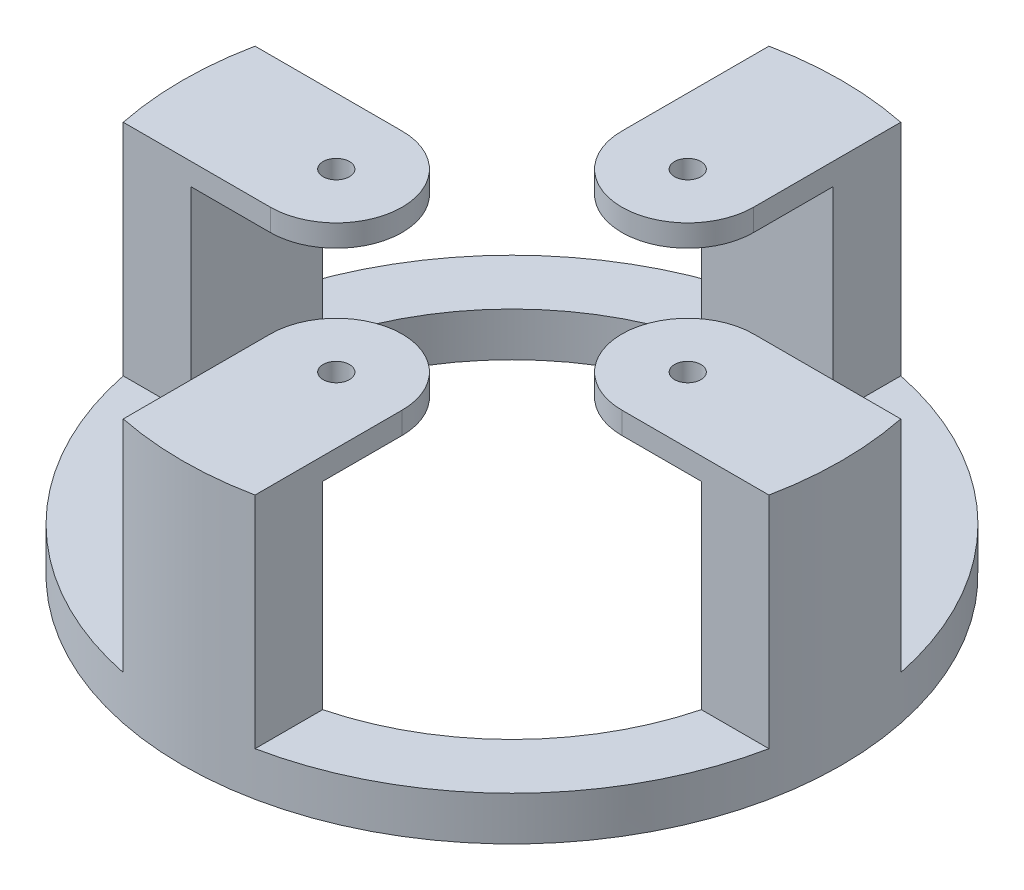
ISO-10303-21;
HEADER;
FILE_DESCRIPTION(('STEP AP214'),'2;1');
FILE_NAME('part.step','',(''),(''),'','','');
FILE_SCHEMA(('AUTOMOTIVE_DESIGN { 1 0 10303 214 1 1 1 1 }'));
ENDSEC;
DATA;
#1=APPLICATION_CONTEXT('core data for automotive mechanical design processes');
#2=APPLICATION_PROTOCOL_DEFINITION('international standard','automotive_design',2000,#1);
#3=PRODUCT_CONTEXT('',#1,'mechanical');
#4=PRODUCT('Part','Part','',(#3));
#5=PRODUCT_RELATED_PRODUCT_CATEGORY('part','',(#4));
#6=PRODUCT_DEFINITION_FORMATION('','',#4);
#7=PRODUCT_DEFINITION_CONTEXT('part definition',#1,'design');
#8=PRODUCT_DEFINITION('design','',#6,#7);
#9=PRODUCT_DEFINITION_SHAPE('','',#8);
#10=(LENGTH_UNIT() NAMED_UNIT(*) SI_UNIT(.MILLI.,.METRE.));
#11=(NAMED_UNIT(*) PLANE_ANGLE_UNIT() SI_UNIT($,.RADIAN.));
#12=(NAMED_UNIT(*) SI_UNIT($,.STERADIAN.) SOLID_ANGLE_UNIT());
#13=UNCERTAINTY_MEASURE_WITH_UNIT(LENGTH_MEASURE(1.E-05),#10,'distance_accuracy_value','');
#14=(GEOMETRIC_REPRESENTATION_CONTEXT(3) GLOBAL_UNCERTAINTY_ASSIGNED_CONTEXT((#13)) GLOBAL_UNIT_ASSIGNED_CONTEXT((#10,
#11,#12)) REPRESENTATION_CONTEXT('',''));
#15=CARTESIAN_POINT('',(0.,0.,0.));
#16=DIRECTION('',(0.,0.,1.));
#17=DIRECTION('',(1.,0.,0.));
#18=AXIS2_PLACEMENT_3D('',#15,#16,#17);
#19=CARTESIAN_POINT('',(0.,60.,58.0947501931114));
#20=DIRECTION('',(0.,0.,-1.));
#21=DIRECTION('',(-1.,0.,0.));
#22=AXIS2_PLACEMENT_3D('',#19,#20,#21);
#23=PLANE('',#22);
#24=DIRECTION('',(0.,-1.,0.));
#25=VECTOR('',#24,1.);
#26=CARTESIAN_POINT('',(-14.9999999999997,60.,58.0947501931114));
#27=LINE('',#26,#25);
#28=CARTESIAN_POINT('',(-14.9999999999997,55.,58.0947501931114));
#29=VERTEX_POINT('',#28);
#30=CARTESIAN_POINT('',(-14.9999999999997,10.,58.0947501931114));
#31=VERTEX_POINT('',#30);
#32=EDGE_CURVE('E59',#29,#31,#27,.T.);
#33=ORIENTED_EDGE('',*,*,#32,.F.);
#34=DIRECTION('',(1.,0.,0.));
#35=VECTOR('',#34,1.);
#36=CARTESIAN_POINT('',(0.,55.,58.0947501931114));
#37=LINE('',#36,#35);
#38=CARTESIAN_POINT('',(15.0000000000004,55.,58.0947501931114));
#39=VERTEX_POINT('',#38);
#40=EDGE_CURVE('E54',#29,#39,#37,.T.);
#41=ORIENTED_EDGE('',*,*,#40,.T.);
#42=DIRECTION('',(0.,-1.,0.));
#43=VECTOR('',#42,1.);
#44=CARTESIAN_POINT('',(15.0000000000004,60.,58.0947501931114));
#45=LINE('',#44,#43);
#46=CARTESIAN_POINT('',(15.0000000000004,10.,58.0947501931114));
#47=VERTEX_POINT('',#46);
#48=EDGE_CURVE('E406',#39,#47,#45,.T.);
#49=ORIENTED_EDGE('',*,*,#48,.T.);
#50=DIRECTION('',(0.,-1.,0.));
#51=VECTOR('',#50,1.);
#52=CARTESIAN_POINT('',(14.9999999999994,10.,58.0947501931114));
#53=LINE('',#52,#51);
#54=CARTESIAN_POINT('',(14.9999999999994,0.,58.0947501931114));
#55=VERTEX_POINT('',#54);
#56=EDGE_CURVE('E441',#47,#55,#53,.T.);
#57=ORIENTED_EDGE('',*,*,#56,.T.);
#58=DIRECTION('',(1.,0.,0.));
#59=VECTOR('',#58,1.);
#60=CARTESIAN_POINT('',(0.,0.,58.0947501931114));
#61=LINE('',#60,#59);
#62=CARTESIAN_POINT('',(-14.9999999999997,0.,58.0947501931114));
#63=VERTEX_POINT('',#62);
#64=EDGE_CURVE('E397',#63,#55,#61,.T.);
#65=ORIENTED_EDGE('',*,*,#64,.F.);
#66=DIRECTION('',(0.,-1.,0.));
#67=VECTOR('',#66,1.);
#68=CARTESIAN_POINT('',(-14.9999999999997,10.,58.0947501931113));
#69=LINE('',#68,#67);
#70=EDGE_CURVE('E434',#63,#31,#69,.F.);
#71=ORIENTED_EDGE('',*,*,#70,.T.);
#72=EDGE_LOOP('',(#33,#41,#49,#57,#65,#71));
#73=FACE_BOUND('',#72,.T.);
#74=ADVANCED_FACE('F39',(#73),#23,.T.);
#75=CARTESIAN_POINT('',(-58.0947501931113,60.,0.));
#76=DIRECTION('',(1.,0.,0.));
#77=DIRECTION('',(0.,0.,-1.));
#78=AXIS2_PLACEMENT_3D('',#75,#76,#77);
#79=PLANE('',#78);
#80=DIRECTION('',(0.,-1.,0.));
#81=VECTOR('',#80,1.);
#82=CARTESIAN_POINT('',(-58.0947501931113,60.,-15.));
#83=LINE('',#82,#81);
#84=CARTESIAN_POINT('',(-58.0947501931113,55.,-15.));
#85=VERTEX_POINT('',#84);
#86=CARTESIAN_POINT('',(-58.0947501931113,10.,-15.));
#87=VERTEX_POINT('',#86);
#88=EDGE_CURVE('E387',#85,#87,#83,.T.);
#89=ORIENTED_EDGE('',*,*,#88,.F.);
#90=DIRECTION('',(0.,0.,1.));
#91=VECTOR('',#90,1.);
#92=CARTESIAN_POINT('',(-58.0947501931113,55.,0.));
#93=LINE('',#92,#91);
#94=CARTESIAN_POINT('',(-58.0947501931113,55.,15.));
#95=VERTEX_POINT('',#94);
#96=EDGE_CURVE('E276',#85,#95,#93,.T.);
#97=ORIENTED_EDGE('',*,*,#96,.T.);
#98=DIRECTION('',(0.,-1.,0.));
#99=VECTOR('',#98,1.);
#100=CARTESIAN_POINT('',(-58.0947501931113,60.,15.));
#101=LINE('',#100,#99);
#102=CARTESIAN_POINT('',(-58.0947501931113,10.,15.));
#103=VERTEX_POINT('',#102);
#104=EDGE_CURVE('E384',#95,#103,#101,.T.);
#105=ORIENTED_EDGE('',*,*,#104,.T.);
#106=DIRECTION('',(0.,-1.,0.));
#107=VECTOR('',#106,1.);
#108=CARTESIAN_POINT('',(-58.0947501931113,10.,15.));
#109=LINE('',#108,#107);
#110=CARTESIAN_POINT('',(-58.0947501931113,0.,15.));
#111=VERTEX_POINT('',#110);
#112=EDGE_CURVE('E447',#103,#111,#109,.T.);
#113=ORIENTED_EDGE('',*,*,#112,.T.);
#114=DIRECTION('',(0.,0.,1.));
#115=VECTOR('',#114,1.);
#116=CARTESIAN_POINT('',(-58.0947501931113,0.,0.));
#117=LINE('',#116,#115);
#118=CARTESIAN_POINT('',(-58.0947501931113,0.,-15.));
#119=VERTEX_POINT('',#118);
#120=EDGE_CURVE('E374',#119,#111,#117,.T.);
#121=ORIENTED_EDGE('',*,*,#120,.F.);
#122=DIRECTION('',(0.,-1.,0.));
#123=VECTOR('',#122,1.);
#124=CARTESIAN_POINT('',(-58.0947501931113,10.,-15.));
#125=LINE('',#124,#123);
#126=EDGE_CURVE('E444',#119,#87,#125,.F.);
#127=ORIENTED_EDGE('',*,*,#126,.T.);
#128=EDGE_LOOP('',(#89,#97,#105,#113,#121,#127));
#129=FACE_BOUND('',#128,.T.);
#130=ADVANCED_FACE('F503',(#129),#79,.T.);
#131=CARTESIAN_POINT('',(-3.76239087433056E-13,60.,-58.0947501931111));
#132=DIRECTION('',(0.,0.,1.));
#133=DIRECTION('',(1.,0.,0.));
#134=AXIS2_PLACEMENT_3D('',#131,#132,#133);
#135=PLANE('',#134);
#136=DIRECTION('',(0.,-1.,0.));
#137=VECTOR('',#136,1.);
#138=CARTESIAN_POINT('',(15.0000000000004,60.,-58.0947501931112));
#139=LINE('',#138,#137);
#140=CARTESIAN_POINT('',(15.0000000000004,55.,-58.0947501931112));
#141=VERTEX_POINT('',#140);
#142=CARTESIAN_POINT('',(15.0000000000004,10.,-58.0947501931112));
#143=VERTEX_POINT('',#142);
#144=EDGE_CURVE('E344',#141,#143,#139,.T.);
#145=ORIENTED_EDGE('',*,*,#144,.F.);
#146=DIRECTION('',(-1.,0.,0.));
#147=VECTOR('',#146,1.);
#148=CARTESIAN_POINT('',(-3.76239087433056E-13,55.,-58.0947501931111));
#149=LINE('',#148,#147);
#150=CARTESIAN_POINT('',(-14.9999999999998,55.,-58.094750193111));
#151=VERTEX_POINT('',#150);
#152=EDGE_CURVE('E11',#141,#151,#149,.T.);
#153=ORIENTED_EDGE('',*,*,#152,.T.);
#154=DIRECTION('',(0.,-1.,0.));
#155=VECTOR('',#154,1.);
#156=CARTESIAN_POINT('',(-14.9999999999998,60.,-58.094750193111));
#157=LINE('',#156,#155);
#158=CARTESIAN_POINT('',(-14.9999999999998,10.,-58.094750193111));
#159=VERTEX_POINT('',#158);
#160=EDGE_CURVE('E341',#151,#159,#157,.T.);
#161=ORIENTED_EDGE('',*,*,#160,.T.);
#162=CARTESIAN_POINT('',(-15.0000000000011,0.,-58.094750193111));
#163=VERTEX_POINT('',#162);
#164=EDGE_CURVE('E343',#159,#163,#157,.T.);
#165=ORIENTED_EDGE('',*,*,#164,.T.);
#166=DIRECTION('',(-1.,0.,0.));
#167=VECTOR('',#166,1.);
#168=CARTESIAN_POINT('',(-3.76239087433056E-13,0.,-58.0947501931111));
#169=LINE('',#168,#167);
#170=CARTESIAN_POINT('',(15.0000000000004,0.,-58.0947501931112));
#171=VERTEX_POINT('',#170);
#172=EDGE_CURVE('E326',#171,#163,#169,.T.);
#173=ORIENTED_EDGE('',*,*,#172,.F.);
#174=EDGE_CURVE('E334',#143,#171,#139,.T.);
#175=ORIENTED_EDGE('',*,*,#174,.F.);
#176=EDGE_LOOP('',(#145,#153,#161,#165,#173,#175));
#177=FACE_BOUND('',#176,.T.);
#178=ADVANCED_FACE('F496',(#177),#135,.T.);
#179=CARTESIAN_POINT('',(58.0947501931112,60.,-4.03113307963993E-13));
#180=DIRECTION('',(-1.,0.,0.));
#181=DIRECTION('',(0.,0.,1.));
#182=AXIS2_PLACEMENT_3D('',#179,#180,#181);
#183=PLANE('',#182);
#184=DIRECTION('',(0.,-1.,0.));
#185=VECTOR('',#184,1.);
#186=CARTESIAN_POINT('',(58.0947501931113,60.,14.9999999999996));
#187=LINE('',#186,#185);
#188=CARTESIAN_POINT('',(58.0947501931113,55.,14.9999999999996));
#189=VERTEX_POINT('',#188);
#190=CARTESIAN_POINT('',(58.0947501931113,10.,14.9999999999996));
#191=VERTEX_POINT('',#190);
#192=EDGE_CURVE('E364',#189,#191,#187,.T.);
#193=ORIENTED_EDGE('',*,*,#192,.F.);
#194=DIRECTION('',(0.,0.,-1.));
#195=VECTOR('',#194,1.);
#196=CARTESIAN_POINT('',(58.0947501931112,55.,-4.03113307963993E-13));
#197=LINE('',#196,#195);
#198=CARTESIAN_POINT('',(58.0947501931111,55.,-15.0000000000004));
#199=VERTEX_POINT('',#198);
#200=EDGE_CURVE('E324',#189,#199,#197,.T.);
#201=ORIENTED_EDGE('',*,*,#200,.T.);
#202=DIRECTION('',(0.,-1.,0.));
#203=VECTOR('',#202,1.);
#204=CARTESIAN_POINT('',(58.0947501931111,60.,-15.0000000000004));
#205=LINE('',#204,#203);
#206=CARTESIAN_POINT('',(58.0947501931111,10.,-15.0000000000004));
#207=VERTEX_POINT('',#206);
#208=EDGE_CURVE('E361',#199,#207,#205,.T.);
#209=ORIENTED_EDGE('',*,*,#208,.T.);
#210=DIRECTION('',(0.,-1.,0.));
#211=VECTOR('',#210,1.);
#212=CARTESIAN_POINT('',(58.0947501931111,10.,-15.0000000000004));
#213=LINE('',#212,#211);
#214=CARTESIAN_POINT('',(58.0947501931111,0.,-15.0000000000004));
#215=VERTEX_POINT('',#214);
#216=EDGE_CURVE('E47',#207,#215,#213,.T.);
#217=ORIENTED_EDGE('',*,*,#216,.T.);
#218=DIRECTION('',(0.,0.,-1.));
#219=VECTOR('',#218,1.);
#220=CARTESIAN_POINT('',(58.0947501931112,0.,-4.03113307963993E-13));
#221=LINE('',#220,#219);
#222=CARTESIAN_POINT('',(58.0947501931113,0.,14.9999999999996));
#223=VERTEX_POINT('',#222);
#224=EDGE_CURVE('E351',#223,#215,#221,.T.);
#225=ORIENTED_EDGE('',*,*,#224,.F.);
#226=DIRECTION('',(0.,-1.,0.));
#227=VECTOR('',#226,1.);
#228=CARTESIAN_POINT('',(58.0947501931114,10.,14.9999999999996));
#229=LINE('',#228,#227);
#230=EDGE_CURVE('E450',#223,#191,#229,.F.);
#231=ORIENTED_EDGE('',*,*,#230,.T.);
#232=EDGE_LOOP('',(#193,#201,#209,#217,#225,#231));
#233=FACE_BOUND('',#232,.T.);
#234=ADVANCED_FACE('F456',(#233),#183,.T.);
#235=CARTESIAN_POINT('',(0.,10.,0.));
#236=DIRECTION('',(0.,1.,0.));
#237=DIRECTION('',(0.,0.,1.));
#238=AXIS2_PLACEMENT_3D('',#235,#236,#237);
#239=PLANE('',#238);
#240=DIRECTION('',(0.,0.,-1.));
#241=VECTOR('',#240,1.);
#242=CARTESIAN_POINT('',(15.0000000000001,10.,0.));
#243=LINE('',#242,#241);
#244=CARTESIAN_POINT('',(15.0000000000005,10.,-73.4846922834952));
#245=VERTEX_POINT('',#244);
#246=EDGE_CURVE('E348',#143,#245,#243,.T.);
#247=ORIENTED_EDGE('',*,*,#246,.F.);
#248=CARTESIAN_POINT('',(0.,10.,0.));
#249=DIRECTION('',(0.,1.,0.));
#250=DIRECTION('',(0.,0.,1.));
#251=AXIS2_PLACEMENT_3D('',#248,#249,#250);
#252=CIRCLE('',#251,60.);
#253=EDGE_CURVE('E423',#207,#143,#252,.T.);
#254=ORIENTED_EDGE('',*,*,#253,.F.);
#255=DIRECTION('',(-1.,0.,0.));
#256=VECTOR('',#255,1.);
#257=CARTESIAN_POINT('',(0.,10.,-15.0000000000004));
#258=LINE('',#257,#256);
#259=CARTESIAN_POINT('',(73.4846922834953,10.,-15.0000000000004));
#260=VERTEX_POINT('',#259);
#261=EDGE_CURVE('E371',#260,#207,#258,.T.);
#262=ORIENTED_EDGE('',*,*,#261,.F.);
#263=CARTESIAN_POINT('',(0.,10.,0.));
#264=DIRECTION('',(0.,1.,0.));
#265=DIRECTION('',(0.,0.,1.));
#266=AXIS2_PLACEMENT_3D('',#263,#264,#265);
#267=CIRCLE('',#266,75.);
#268=EDGE_CURVE('E435',#260,#245,#267,.T.);
#269=ORIENTED_EDGE('',*,*,#268,.T.);
#270=EDGE_LOOP('',(#247,#254,#262,#269));
#271=FACE_BOUND('',#270,.T.);
#272=ADVANCED_FACE('F486',(#271),#239,.T.);
#273=CARTESIAN_POINT('',(0.,10.,0.));
#274=DIRECTION('',(0.,-1.,0.));
#275=DIRECTION('',(0.,0.,-1.));
#276=AXIS2_PLACEMENT_3D('',#273,#274,#275);
#277=CYLINDRICAL_SURFACE('',#276,60.);
#278=ORIENTED_EDGE('',*,*,#164,.F.);
#279=EDGE_CURVE('E424',#159,#87,#252,.T.);
#280=ORIENTED_EDGE('',*,*,#279,.T.);
#281=ORIENTED_EDGE('',*,*,#126,.F.);
#282=CARTESIAN_POINT('',(0.,0.,0.));
#283=DIRECTION('',(0.,1.,0.));
#284=DIRECTION('',(0.,0.,1.));
#285=AXIS2_PLACEMENT_3D('',#282,#283,#284);
#286=CIRCLE('',#285,60.);
#287=EDGE_CURVE('E430',#163,#119,#286,.T.);
#288=ORIENTED_EDGE('',*,*,#287,.F.);
#289=EDGE_LOOP('',(#278,#280,#281,#288));
#290=FACE_BOUND('',#289,.T.);
#291=ADVANCED_FACE('F505',(#290),#277,.F.);
#292=DIRECTION('',(0.,0.,1.));
#293=VECTOR('',#292,1.);
#294=CARTESIAN_POINT('',(-14.9999999999994,10.,1.08209278966565E-13));
#295=LINE('',#294,#293);
#296=CARTESIAN_POINT('',(-14.9999999999999,10.,-73.4846922834954));
#297=VERTEX_POINT('',#296);
#298=EDGE_CURVE('E338',#297,#159,#295,.T.);
#299=ORIENTED_EDGE('',*,*,#298,.F.);
#300=CARTESIAN_POINT('',(-73.4846922834954,10.,-15.));
#301=VERTEX_POINT('',#300);
#302=EDGE_CURVE('E436',#297,#301,#267,.T.);
#303=ORIENTED_EDGE('',*,*,#302,.T.);
#304=DIRECTION('',(-1.,0.,0.));
#305=VECTOR('',#304,1.);
#306=CARTESIAN_POINT('',(0.,10.,-15.));
#307=LINE('',#306,#305);
#308=EDGE_CURVE('E386',#87,#301,#307,.T.);
#309=ORIENTED_EDGE('',*,*,#308,.F.);
#310=ORIENTED_EDGE('',*,*,#279,.F.);
#311=EDGE_LOOP('',(#299,#303,#309,#310));
#312=FACE_BOUND('',#311,.T.);
#313=ADVANCED_FACE('F509',(#312),#239,.T.);
#314=ORIENTED_EDGE('',*,*,#174,.T.);
#315=EDGE_CURVE('E429',#215,#171,#286,.T.);
#316=ORIENTED_EDGE('',*,*,#315,.F.);
#317=ORIENTED_EDGE('',*,*,#216,.F.);
#318=ORIENTED_EDGE('',*,*,#253,.T.);
#319=EDGE_LOOP('',(#314,#316,#317,#318));
#320=FACE_BOUND('',#319,.T.);
#321=ADVANCED_FACE('F464',(#320),#277,.F.);
#322=DIRECTION('',(1.,0.,0.));
#323=VECTOR('',#322,1.);
#324=CARTESIAN_POINT('',(0.,10.,15.));
#325=LINE('',#324,#323);
#326=CARTESIAN_POINT('',(-73.4846922834954,10.,15.));
#327=VERTEX_POINT('',#326);
#328=EDGE_CURVE('E394',#327,#103,#325,.T.);
#329=ORIENTED_EDGE('',*,*,#328,.F.);
#330=CARTESIAN_POINT('',(-14.9999999999997,10.,73.4846922834956));
#331=VERTEX_POINT('',#330);
#332=EDGE_CURVE('E437',#327,#331,#267,.T.);
#333=ORIENTED_EDGE('',*,*,#332,.T.);
#334=DIRECTION('',(0.,0.,1.));
#335=VECTOR('',#334,1.);
#336=CARTESIAN_POINT('',(-14.9999999999993,10.,0.));
#337=LINE('',#336,#335);
#338=EDGE_CURVE('E408',#31,#331,#337,.T.);
#339=ORIENTED_EDGE('',*,*,#338,.F.);
#340=EDGE_CURVE('E425',#103,#31,#252,.T.);
#341=ORIENTED_EDGE('',*,*,#340,.F.);
#342=EDGE_LOOP('',(#329,#333,#339,#341));
#343=FACE_BOUND('',#342,.T.);
#344=ADVANCED_FACE('F537',(#343),#239,.T.);
#345=ORIENTED_EDGE('',*,*,#112,.F.);
#346=ORIENTED_EDGE('',*,*,#340,.T.);
#347=ORIENTED_EDGE('',*,*,#70,.F.);
#348=EDGE_CURVE('E418',#111,#63,#286,.T.);
#349=ORIENTED_EDGE('',*,*,#348,.F.);
#350=EDGE_LOOP('',(#345,#346,#347,#349));
#351=FACE_BOUND('',#350,.T.);
#352=ADVANCED_FACE('F478',(#351),#277,.F.);
#353=DIRECTION('',(1.,0.,0.));
#354=VECTOR('',#353,1.);
#355=CARTESIAN_POINT('',(0.,10.,14.9999999999996));
#356=LINE('',#355,#354);
#357=CARTESIAN_POINT('',(73.4846922834954,10.,14.9999999999996));
#358=VERTEX_POINT('',#357);
#359=EDGE_CURVE('E363',#191,#358,#356,.T.);
#360=ORIENTED_EDGE('',*,*,#359,.F.);
#361=EDGE_CURVE('E419',#47,#191,#252,.T.);
#362=ORIENTED_EDGE('',*,*,#361,.F.);
#363=DIRECTION('',(0.,0.,-1.));
#364=VECTOR('',#363,1.);
#365=CARTESIAN_POINT('',(14.9999999999999,10.,-1.21735438837391E-13));
#366=LINE('',#365,#364);
#367=CARTESIAN_POINT('',(15.0000000000005,10.,73.4846922834954));
#368=VERTEX_POINT('',#367);
#369=EDGE_CURVE('E415',#368,#47,#366,.T.);
#370=ORIENTED_EDGE('',*,*,#369,.F.);
#371=EDGE_CURVE('E431',#368,#358,#267,.T.);
#372=ORIENTED_EDGE('',*,*,#371,.T.);
#373=EDGE_LOOP('',(#360,#362,#370,#372));
#374=FACE_BOUND('',#373,.T.);
#375=ADVANCED_FACE('F553',(#374),#239,.T.);
#376=CARTESIAN_POINT('',(0.,0.,0.));
#377=DIRECTION('',(0.,1.,0.));
#378=DIRECTION('',(0.,0.,1.));
#379=AXIS2_PLACEMENT_3D('',#376,#377,#378);
#380=PLANE('',#379);
#381=CARTESIAN_POINT('',(0.,0.,0.));
#382=DIRECTION('',(0.,1.,0.));
#383=DIRECTION('',(0.,0.,1.));
#384=AXIS2_PLACEMENT_3D('',#381,#382,#383);
#385=CIRCLE('',#384,75.);
#386=CARTESIAN_POINT('',(0.,0.,75.));
#387=VERTEX_POINT('',#386);
#388=EDGE_CURVE('E422',#387,#387,#385,.T.);
#389=ORIENTED_EDGE('',*,*,#388,.F.);
#390=EDGE_LOOP('',(#389));
#391=FACE_BOUND('',#390,.T.);
#392=ORIENTED_EDGE('',*,*,#315,.T.);
#393=ORIENTED_EDGE('',*,*,#172,.T.);
#394=ORIENTED_EDGE('',*,*,#287,.T.);
#395=ORIENTED_EDGE('',*,*,#120,.T.);
#396=ORIENTED_EDGE('',*,*,#348,.T.);
#397=ORIENTED_EDGE('',*,*,#64,.T.);
#398=EDGE_CURVE('E426',#55,#223,#286,.T.);
#399=ORIENTED_EDGE('',*,*,#398,.T.);
#400=ORIENTED_EDGE('',*,*,#224,.T.);
#401=EDGE_LOOP('',(#392,#393,#394,#395,#396,#397,#399,#400));
#402=FACE_BOUND('',#401,.T.);
#403=ADVANCED_FACE('F469',(#391,#402),#380,.F.);
#404=CARTESIAN_POINT('',(0.,10.,0.));
#405=DIRECTION('',(0.,-1.,0.));
#406=DIRECTION('',(0.,0.,-1.));
#407=AXIS2_PLACEMENT_3D('',#404,#405,#406);
#408=CYLINDRICAL_SURFACE('',#407,75.);
#409=DIRECTION('',(0.,-1.,0.));
#410=VECTOR('',#409,1.);
#411=CARTESIAN_POINT('',(-14.9999999999997,60.,73.4846922834956));
#412=LINE('',#411,#410);
#413=CARTESIAN_POINT('',(-14.9999999999997,60.,73.4846922834956));
#414=VERTEX_POINT('',#413);
#415=EDGE_CURVE('E410',#414,#331,#412,.T.);
#416=ORIENTED_EDGE('',*,*,#415,.T.);
#417=ORIENTED_EDGE('',*,*,#332,.F.);
#418=DIRECTION('',(0.,-1.,0.));
#419=VECTOR('',#418,1.);
#420=CARTESIAN_POINT('',(-73.4846922834954,60.,15.));
#421=LINE('',#420,#419);
#422=CARTESIAN_POINT('',(-73.4846922834954,60.,15.));
#423=VERTEX_POINT('',#422);
#424=EDGE_CURVE('E382',#423,#327,#421,.T.);
#425=ORIENTED_EDGE('',*,*,#424,.F.);
#426=CARTESIAN_POINT('',(0.,60.,0.));
#427=DIRECTION('',(0.,1.,0.));
#428=DIRECTION('',(0.,0.,1.));
#429=AXIS2_PLACEMENT_3D('',#426,#427,#428);
#430=CIRCLE('',#429,75.);
#431=CARTESIAN_POINT('',(-73.4846922834954,60.,-15.));
#432=VERTEX_POINT('',#431);
#433=EDGE_CURVE('E378',#432,#423,#430,.T.);
#434=ORIENTED_EDGE('',*,*,#433,.F.);
#435=DIRECTION('',(0.,-1.,0.));
#436=VECTOR('',#435,1.);
#437=CARTESIAN_POINT('',(-73.4846922834954,60.,-15.));
#438=LINE('',#437,#436);
#439=EDGE_CURVE('E389',#432,#301,#438,.T.);
#440=ORIENTED_EDGE('',*,*,#439,.T.);
#441=ORIENTED_EDGE('',*,*,#302,.F.);
#442=DIRECTION('',(0.,-1.,0.));
#443=VECTOR('',#442,1.);
#444=CARTESIAN_POINT('',(-14.9999999999999,60.,-73.4846922834954));
#445=LINE('',#444,#443);
#446=CARTESIAN_POINT('',(-14.9999999999999,60.,-73.4846922834954));
#447=VERTEX_POINT('',#446);
#448=EDGE_CURVE('E339',#447,#297,#445,.T.);
#449=ORIENTED_EDGE('',*,*,#448,.F.);
#450=CARTESIAN_POINT('',(0.,60.,0.));
#451=DIRECTION('',(0.,1.,0.));
#452=DIRECTION('',(0.,0.,1.));
#453=AXIS2_PLACEMENT_3D('',#450,#451,#452);
#454=CIRCLE('',#453,75.);
#455=CARTESIAN_POINT('',(15.0000000000005,60.,-73.4846922834952));
#456=VERTEX_POINT('',#455);
#457=EDGE_CURVE('E332',#456,#447,#454,.T.);
#458=ORIENTED_EDGE('',*,*,#457,.F.);
#459=DIRECTION('',(0.,-1.,0.));
#460=VECTOR('',#459,1.);
#461=CARTESIAN_POINT('',(15.0000000000005,60.,-73.4846922834952));
#462=LINE('',#461,#460);
#463=EDGE_CURVE('E336',#456,#245,#462,.T.);
#464=ORIENTED_EDGE('',*,*,#463,.T.);
#465=ORIENTED_EDGE('',*,*,#268,.F.);
#466=DIRECTION('',(0.,-1.,0.));
#467=VECTOR('',#466,1.);
#468=CARTESIAN_POINT('',(73.4846922834953,60.,-15.0000000000004));
#469=LINE('',#468,#467);
#470=CARTESIAN_POINT('',(73.4846922834953,60.,-15.0000000000004));
#471=VERTEX_POINT('',#470);
#472=EDGE_CURVE('E359',#471,#260,#469,.T.);
#473=ORIENTED_EDGE('',*,*,#472,.F.);
#474=CARTESIAN_POINT('',(0.,60.,0.));
#475=DIRECTION('',(0.,1.,0.));
#476=DIRECTION('',(0.,0.,1.));
#477=AXIS2_PLACEMENT_3D('',#474,#475,#476);
#478=CIRCLE('',#477,75.);
#479=CARTESIAN_POINT('',(73.4846922834954,60.,14.9999999999996));
#480=VERTEX_POINT('',#479);
#481=EDGE_CURVE('E355',#480,#471,#478,.T.);
#482=ORIENTED_EDGE('',*,*,#481,.F.);
#483=DIRECTION('',(0.,-1.,0.));
#484=VECTOR('',#483,1.);
#485=CARTESIAN_POINT('',(73.4846922834954,60.,14.9999999999996));
#486=LINE('',#485,#484);
#487=EDGE_CURVE('E366',#480,#358,#486,.T.);
#488=ORIENTED_EDGE('',*,*,#487,.T.);
#489=ORIENTED_EDGE('',*,*,#371,.F.);
#490=DIRECTION('',(0.,-1.,0.));
#491=VECTOR('',#490,1.);
#492=CARTESIAN_POINT('',(15.0000000000005,60.,73.4846922834954));
#493=LINE('',#492,#491);
#494=CARTESIAN_POINT('',(15.0000000000005,60.,73.4846922834954));
#495=VERTEX_POINT('',#494);
#496=EDGE_CURVE('E404',#495,#368,#493,.T.);
#497=ORIENTED_EDGE('',*,*,#496,.F.);
#498=CARTESIAN_POINT('',(0.,60.,0.));
#499=DIRECTION('',(0.,1.,0.));
#500=DIRECTION('',(0.,0.,1.));
#501=AXIS2_PLACEMENT_3D('',#498,#499,#500);
#502=CIRCLE('',#501,75.0000000000002);
#503=EDGE_CURVE('E401',#414,#495,#502,.T.);
#504=ORIENTED_EDGE('',*,*,#503,.F.);
#505=EDGE_LOOP('',(#416,#417,#425,#434,#440,#441,#449,#458,#464,#465,#473,#482,#488,#489,#497,#504));
#506=FACE_BOUND('',#505,.T.);
#507=ORIENTED_EDGE('',*,*,#388,.T.);
#508=EDGE_LOOP('',(#507));
#509=FACE_BOUND('',#508,.T.);
#510=ADVANCED_FACE('F41',(#506,#509),#408,.T.);
#511=ORIENTED_EDGE('',*,*,#230,.F.);
#512=ORIENTED_EDGE('',*,*,#398,.F.);
#513=ORIENTED_EDGE('',*,*,#56,.F.);
#514=ORIENTED_EDGE('',*,*,#361,.T.);
#515=EDGE_LOOP('',(#511,#512,#513,#514));
#516=FACE_BOUND('',#515,.T.);
#517=ADVANCED_FACE('F551',(#516),#277,.F.);
#518=CARTESIAN_POINT('',(14.9999999999999,60.,-1.21735438837391E-13));
#519=DIRECTION('',(1.,0.,0.));
#520=DIRECTION('',(0.,0.,-1.));
#521=AXIS2_PLACEMENT_3D('',#518,#519,#520);
#522=PLANE('',#521);
#523=ORIENTED_EDGE('',*,*,#496,.T.);
#524=ORIENTED_EDGE('',*,*,#369,.T.);
#525=ORIENTED_EDGE('',*,*,#48,.F.);
#526=DIRECTION('',(0.,0.,1.));
#527=VECTOR('',#526,1.);
#528=CARTESIAN_POINT('',(14.9999999999997,55.,-1.78316121023056E-13));
#529=LINE('',#528,#527);
#530=CARTESIAN_POINT('',(15.0000000000002,55.,40.0000000000002));
#531=VERTEX_POINT('',#530);
#532=EDGE_CURVE('E244',#531,#39,#529,.T.);
#533=ORIENTED_EDGE('',*,*,#532,.F.);
#534=DIRECTION('',(0.,1.,0.));
#535=VECTOR('',#534,1.);
#536=CARTESIAN_POINT('',(15.0000000000002,55.,40.0000000000002));
#537=LINE('',#536,#535);
#538=CARTESIAN_POINT('',(15.0000000000002,60.,40.0000000000002));
#539=VERTEX_POINT('',#538);
#540=EDGE_CURVE('E239',#531,#539,#537,.T.);
#541=ORIENTED_EDGE('',*,*,#540,.T.);
#542=DIRECTION('',(0.,0.,1.));
#543=VECTOR('',#542,1.);
#544=CARTESIAN_POINT('',(14.9999999999999,60.,-1.21735438837391E-13));
#545=LINE('',#544,#543);
#546=EDGE_CURVE('E398',#539,#495,#545,.T.);
#547=ORIENTED_EDGE('',*,*,#546,.T.);
#548=EDGE_LOOP('',(#523,#524,#525,#533,#541,#547));
#549=FACE_BOUND('',#548,.T.);
#550=ADVANCED_FACE('F546',(#549),#522,.T.);
#551=CARTESIAN_POINT('',(-14.9999999999993,60.,0.));
#552=DIRECTION('',(-1.,0.,0.));
#553=DIRECTION('',(0.,0.,1.));
#554=AXIS2_PLACEMENT_3D('',#551,#552,#553);
#555=PLANE('',#554);
#556=DIRECTION('',(0.,0.,-1.));
#557=VECTOR('',#556,1.);
#558=CARTESIAN_POINT('',(-14.9999999999993,60.,0.));
#559=LINE('',#558,#557);
#560=CARTESIAN_POINT('',(-14.9999999999998,60.,40.0000000000001));
#561=VERTEX_POINT('',#560);
#562=EDGE_CURVE('E235',#414,#561,#559,.T.);
#563=ORIENTED_EDGE('',*,*,#562,.T.);
#564=DIRECTION('',(0.,1.,0.));
#565=VECTOR('',#564,1.);
#566=CARTESIAN_POINT('',(-14.9999999999998,55.,40.0000000000001));
#567=LINE('',#566,#565);
#568=CARTESIAN_POINT('',(-14.9999999999998,55.,40.0000000000001));
#569=VERTEX_POINT('',#568);
#570=EDGE_CURVE('E232',#569,#561,#567,.T.);
#571=ORIENTED_EDGE('',*,*,#570,.F.);
#572=DIRECTION('',(0.,0.,-1.));
#573=VECTOR('',#572,1.);
#574=CARTESIAN_POINT('',(-14.9999999999993,55.,0.));
#575=LINE('',#574,#573);
#576=EDGE_CURVE('E221',#29,#569,#575,.T.);
#577=ORIENTED_EDGE('',*,*,#576,.F.);
#578=ORIENTED_EDGE('',*,*,#32,.T.);
#579=ORIENTED_EDGE('',*,*,#338,.T.);
#580=ORIENTED_EDGE('',*,*,#415,.F.);
#581=EDGE_LOOP('',(#563,#571,#577,#578,#579,#580));
#582=FACE_BOUND('',#581,.T.);
#583=ADVANCED_FACE('F233',(#582),#555,.T.);
#584=CARTESIAN_POINT('',(0.,60.,0.));
#585=DIRECTION('',(0.,1.,0.));
#586=DIRECTION('',(0.,0.,1.));
#587=AXIS2_PLACEMENT_3D('',#584,#585,#586);
#588=PLANE('',#587);
#589=ORIENTED_EDGE('',*,*,#546,.F.);
#590=CARTESIAN_POINT('',(2.56739074444567E-13,60.,40.));
#591=DIRECTION('',(0.,1.,0.));
#592=DIRECTION('',(0.,0.,1.));
#593=AXIS2_PLACEMENT_3D('',#590,#591,#592);
#594=CIRCLE('',#593,15.);
#595=EDGE_CURVE('E229',#539,#561,#594,.T.);
#596=ORIENTED_EDGE('',*,*,#595,.T.);
#597=ORIENTED_EDGE('',*,*,#562,.F.);
#598=ORIENTED_EDGE('',*,*,#503,.T.);
#599=EDGE_LOOP('',(#589,#596,#597,#598));
#600=FACE_BOUND('',#599,.T.);
#601=CARTESIAN_POINT('',(2.56739074444567E-13,60.,40.));
#602=DIRECTION('',(0.,1.,0.));
#603=DIRECTION('',(0.,0.,1.));
#604=AXIS2_PLACEMENT_3D('',#601,#602,#603);
#605=CIRCLE('',#604,2.9999999999999);
#606=CARTESIAN_POINT('',(2.56739074444567E-13,60.,42.9999999999999));
#607=VERTEX_POINT('',#606);
#608=EDGE_CURVE('E806',#607,#607,#605,.T.);
#609=ORIENTED_EDGE('',*,*,#608,.F.);
#610=EDGE_LOOP('',(#609));
#611=FACE_BOUND('',#610,.T.);
#612=ADVANCED_FACE('F543',(#600,#611),#588,.T.);
#613=CARTESIAN_POINT('',(0.,60.,15.));
#614=DIRECTION('',(0.,0.,1.));
#615=DIRECTION('',(1.,0.,0.));
#616=AXIS2_PLACEMENT_3D('',#613,#614,#615);
#617=PLANE('',#616);
#618=ORIENTED_EDGE('',*,*,#424,.T.);
#619=ORIENTED_EDGE('',*,*,#328,.T.);
#620=ORIENTED_EDGE('',*,*,#104,.F.);
#621=DIRECTION('',(-1.,0.,0.));
#622=VECTOR('',#621,1.);
#623=CARTESIAN_POINT('',(0.,55.,15.));
#624=LINE('',#623,#622);
#625=CARTESIAN_POINT('',(-40.,55.,15.));
#626=VERTEX_POINT('',#625);
#627=EDGE_CURVE('E260',#626,#95,#624,.T.);
#628=ORIENTED_EDGE('',*,*,#627,.F.);
#629=DIRECTION('',(0.,1.,0.));
#630=VECTOR('',#629,1.);
#631=CARTESIAN_POINT('',(-40.,55.,15.));
#632=LINE('',#631,#630);
#633=CARTESIAN_POINT('',(-40.,60.,15.));
#634=VERTEX_POINT('',#633);
#635=EDGE_CURVE('E268',#626,#634,#632,.T.);
#636=ORIENTED_EDGE('',*,*,#635,.T.);
#637=DIRECTION('',(-1.,0.,0.));
#638=VECTOR('',#637,1.);
#639=CARTESIAN_POINT('',(0.,60.,15.));
#640=LINE('',#639,#638);
#641=EDGE_CURVE('E375',#634,#423,#640,.T.);
#642=ORIENTED_EDGE('',*,*,#641,.T.);
#643=EDGE_LOOP('',(#618,#619,#620,#628,#636,#642));
#644=FACE_BOUND('',#643,.T.);
#645=ADVANCED_FACE('F525',(#644),#617,.T.);
#646=CARTESIAN_POINT('',(0.,60.,-15.));
#647=DIRECTION('',(0.,0.,-1.));
#648=DIRECTION('',(-1.,0.,0.));
#649=AXIS2_PLACEMENT_3D('',#646,#647,#648);
#650=PLANE('',#649);
#651=DIRECTION('',(1.,0.,0.));
#652=VECTOR('',#651,1.);
#653=CARTESIAN_POINT('',(0.,60.,-15.));
#654=LINE('',#653,#652);
#655=CARTESIAN_POINT('',(-40.,60.,-15.));
#656=VERTEX_POINT('',#655);
#657=EDGE_CURVE('E380',#432,#656,#654,.T.);
#658=ORIENTED_EDGE('',*,*,#657,.T.);
#659=DIRECTION('',(0.,1.,0.));
#660=VECTOR('',#659,1.);
#661=CARTESIAN_POINT('',(-40.,55.,-15.));
#662=LINE('',#661,#660);
#663=CARTESIAN_POINT('',(-40.,55.,-15.));
#664=VERTEX_POINT('',#663);
#665=EDGE_CURVE('E273',#664,#656,#662,.T.);
#666=ORIENTED_EDGE('',*,*,#665,.F.);
#667=DIRECTION('',(1.,0.,0.));
#668=VECTOR('',#667,1.);
#669=CARTESIAN_POINT('',(0.,55.,-15.));
#670=LINE('',#669,#668);
#671=EDGE_CURVE('E263',#85,#664,#670,.T.);
#672=ORIENTED_EDGE('',*,*,#671,.F.);
#673=ORIENTED_EDGE('',*,*,#88,.T.);
#674=ORIENTED_EDGE('',*,*,#308,.T.);
#675=ORIENTED_EDGE('',*,*,#439,.F.);
#676=EDGE_LOOP('',(#658,#666,#672,#673,#674,#675));
#677=FACE_BOUND('',#676,.T.);
#678=ADVANCED_FACE('F513',(#677),#650,.T.);
#679=CARTESIAN_POINT('',(0.,60.,0.));
#680=DIRECTION('',(0.,1.,0.));
#681=DIRECTION('',(0.,0.,1.));
#682=AXIS2_PLACEMENT_3D('',#679,#680,#681);
#683=PLANE('',#682);
#684=ORIENTED_EDGE('',*,*,#641,.F.);
#685=CARTESIAN_POINT('',(-40.,60.,0.));
#686=DIRECTION('',(0.,1.,0.));
#687=DIRECTION('',(0.,0.,1.));
#688=AXIS2_PLACEMENT_3D('',#685,#686,#687);
#689=CIRCLE('',#688,15.);
#690=EDGE_CURVE('E257',#634,#656,#689,.T.);
#691=ORIENTED_EDGE('',*,*,#690,.T.);
#692=ORIENTED_EDGE('',*,*,#657,.F.);
#693=ORIENTED_EDGE('',*,*,#433,.T.);
#694=EDGE_LOOP('',(#684,#691,#692,#693));
#695=FACE_BOUND('',#694,.T.);
#696=CARTESIAN_POINT('',(-40.,60.,0.));
#697=DIRECTION('',(0.,1.,0.));
#698=DIRECTION('',(0.,0.,1.));
#699=AXIS2_PLACEMENT_3D('',#696,#697,#698);
#700=CIRCLE('',#699,3.);
#701=CARTESIAN_POINT('',(-40.,60.,3.));
#702=VERTEX_POINT('',#701);
#703=EDGE_CURVE('E253',#702,#702,#700,.T.);
#704=ORIENTED_EDGE('',*,*,#703,.F.);
#705=EDGE_LOOP('',(#704));
#706=FACE_BOUND('',#705,.T.);
#707=ADVANCED_FACE('F531',(#695,#706),#683,.T.);
#708=CARTESIAN_POINT('',(0.,60.,-15.0000000000004));
#709=DIRECTION('',(0.,0.,-1.));
#710=DIRECTION('',(-1.,0.,0.));
#711=AXIS2_PLACEMENT_3D('',#708,#709,#710);
#712=PLANE('',#711);
#713=ORIENTED_EDGE('',*,*,#472,.T.);
#714=ORIENTED_EDGE('',*,*,#261,.T.);
#715=ORIENTED_EDGE('',*,*,#208,.F.);
#716=DIRECTION('',(1.,0.,0.));
#717=VECTOR('',#716,1.);
#718=CARTESIAN_POINT('',(-3.566322420461E-13,55.,-14.9999999999991));
#719=LINE('',#718,#717);
#720=CARTESIAN_POINT('',(40.,55.,-15.));
#721=VERTEX_POINT('',#720);
#722=EDGE_CURVE('E313',#721,#199,#719,.T.);
#723=ORIENTED_EDGE('',*,*,#722,.F.);
#724=DIRECTION('',(0.,1.,0.));
#725=VECTOR('',#724,1.);
#726=CARTESIAN_POINT('',(40.,55.,-15.));
#727=LINE('',#726,#725);
#728=CARTESIAN_POINT('',(40.,60.,-15.));
#729=VERTEX_POINT('',#728);
#730=EDGE_CURVE('E316',#721,#729,#727,.T.);
#731=ORIENTED_EDGE('',*,*,#730,.T.);
#732=DIRECTION('',(1.,0.,0.));
#733=VECTOR('',#732,1.);
#734=CARTESIAN_POINT('',(0.,60.,-15.0000000000004));
#735=LINE('',#734,#733);
#736=EDGE_CURVE('E352',#729,#471,#735,.T.);
#737=ORIENTED_EDGE('',*,*,#736,.T.);
#738=EDGE_LOOP('',(#713,#714,#715,#723,#731,#737));
#739=FACE_BOUND('',#738,.T.);
#740=ADVANCED_FACE('F566',(#739),#712,.T.);
#741=CARTESIAN_POINT('',(0.,60.,14.9999999999996));
#742=DIRECTION('',(0.,0.,1.));
#743=DIRECTION('',(1.,0.,0.));
#744=AXIS2_PLACEMENT_3D('',#741,#742,#743);
#745=PLANE('',#744);
#746=DIRECTION('',(-1.,0.,0.));
#747=VECTOR('',#746,1.);
#748=CARTESIAN_POINT('',(0.,60.,14.9999999999996));
#749=LINE('',#748,#747);
#750=CARTESIAN_POINT('',(40.,60.,15.));
#751=VERTEX_POINT('',#750);
#752=EDGE_CURVE('E357',#480,#751,#749,.T.);
#753=ORIENTED_EDGE('',*,*,#752,.T.);
#754=DIRECTION('',(0.,1.,0.));
#755=VECTOR('',#754,1.);
#756=CARTESIAN_POINT('',(40.,55.,15.));
#757=LINE('',#756,#755);
#758=CARTESIAN_POINT('',(40.,55.,15.));
#759=VERTEX_POINT('',#758);
#760=EDGE_CURVE('E321',#759,#751,#757,.T.);
#761=ORIENTED_EDGE('',*,*,#760,.F.);
#762=DIRECTION('',(-1.,0.,0.));
#763=VECTOR('',#762,1.);
#764=CARTESIAN_POINT('',(0.,55.,14.9999999999996));
#765=LINE('',#764,#763);
#766=EDGE_CURVE('E308',#189,#759,#765,.T.);
#767=ORIENTED_EDGE('',*,*,#766,.F.);
#768=ORIENTED_EDGE('',*,*,#192,.T.);
#769=ORIENTED_EDGE('',*,*,#359,.T.);
#770=ORIENTED_EDGE('',*,*,#487,.F.);
#771=EDGE_LOOP('',(#753,#761,#767,#768,#769,#770));
#772=FACE_BOUND('',#771,.T.);
#773=ADVANCED_FACE('F555',(#772),#745,.T.);
#774=CARTESIAN_POINT('',(0.,60.,0.));
#775=DIRECTION('',(0.,1.,0.));
#776=DIRECTION('',(0.,0.,1.));
#777=AXIS2_PLACEMENT_3D('',#774,#775,#776);
#778=PLANE('',#777);
#779=ORIENTED_EDGE('',*,*,#736,.F.);
#780=CARTESIAN_POINT('',(40.,60.,0.));
#781=DIRECTION('',(0.,1.,0.));
#782=DIRECTION('',(0.,0.,1.));
#783=AXIS2_PLACEMENT_3D('',#780,#781,#782);
#784=CIRCLE('',#783,15.);
#785=EDGE_CURVE('E305',#729,#751,#784,.T.);
#786=ORIENTED_EDGE('',*,*,#785,.T.);
#787=ORIENTED_EDGE('',*,*,#752,.F.);
#788=ORIENTED_EDGE('',*,*,#481,.T.);
#789=EDGE_LOOP('',(#779,#786,#787,#788));
#790=FACE_BOUND('',#789,.T.);
#791=CARTESIAN_POINT('',(40.,60.,0.));
#792=DIRECTION('',(0.,1.,0.));
#793=DIRECTION('',(0.,0.,1.));
#794=AXIS2_PLACEMENT_3D('',#791,#792,#793);
#795=CIRCLE('',#794,3.);
#796=CARTESIAN_POINT('',(40.,60.,2.99999999999999));
#797=VERTEX_POINT('',#796);
#798=EDGE_CURVE('E301',#797,#797,#795,.T.);
#799=ORIENTED_EDGE('',*,*,#798,.F.);
#800=EDGE_LOOP('',(#799));
#801=FACE_BOUND('',#800,.T.);
#802=ADVANCED_FACE('F594',(#790,#801),#778,.T.);
#803=CARTESIAN_POINT('',(15.0000000000001,60.,0.));
#804=DIRECTION('',(1.,0.,0.));
#805=DIRECTION('',(0.,0.,-1.));
#806=AXIS2_PLACEMENT_3D('',#803,#804,#805);
#807=PLANE('',#806);
#808=DIRECTION('',(0.,0.,1.));
#809=VECTOR('',#808,1.);
#810=CARTESIAN_POINT('',(15.,55.,1.2173543883739E-13));
#811=LINE('',#810,#809);
#812=CARTESIAN_POINT('',(15.,55.,-39.9999999999999));
#813=VERTEX_POINT('',#812);
#814=EDGE_CURVE('E285',#141,#813,#811,.T.);
#815=ORIENTED_EDGE('',*,*,#814,.F.);
#816=ORIENTED_EDGE('',*,*,#144,.T.);
#817=ORIENTED_EDGE('',*,*,#246,.T.);
#818=ORIENTED_EDGE('',*,*,#463,.F.);
#819=DIRECTION('',(0.,0.,1.));
#820=VECTOR('',#819,1.);
#821=CARTESIAN_POINT('',(15.0000000000001,60.,0.));
#822=LINE('',#821,#820);
#823=CARTESIAN_POINT('',(15.,60.,-39.9999999999999));
#824=VERTEX_POINT('',#823);
#825=EDGE_CURVE('E327',#456,#824,#822,.T.);
#826=ORIENTED_EDGE('',*,*,#825,.T.);
#827=DIRECTION('',(0.,1.,0.));
#828=VECTOR('',#827,1.);
#829=CARTESIAN_POINT('',(15.,55.,-39.9999999999999));
#830=LINE('',#829,#828);
#831=EDGE_CURVE('E298',#813,#824,#830,.T.);
#832=ORIENTED_EDGE('',*,*,#831,.F.);
#833=EDGE_LOOP('',(#815,#816,#817,#818,#826,#832));
#834=FACE_BOUND('',#833,.T.);
#835=ADVANCED_FACE('F491',(#834),#807,.T.);
#836=CARTESIAN_POINT('',(-14.9999999999994,60.,1.08209278966565E-13));
#837=DIRECTION('',(-1.,0.,0.));
#838=DIRECTION('',(0.,0.,1.));
#839=AXIS2_PLACEMENT_3D('',#836,#837,#838);
#840=PLANE('',#839);
#841=ORIENTED_EDGE('',*,*,#448,.T.);
#842=ORIENTED_EDGE('',*,*,#298,.T.);
#843=ORIENTED_EDGE('',*,*,#160,.F.);
#844=DIRECTION('',(0.,0.,-1.));
#845=VECTOR('',#844,1.);
#846=CARTESIAN_POINT('',(-15.0000000000009,55.,-2.7035024800272E-13));
#847=LINE('',#846,#845);
#848=CARTESIAN_POINT('',(-15.0000000000002,55.,-39.9999999999997));
#849=VERTEX_POINT('',#848);
#850=EDGE_CURVE('E290',#849,#151,#847,.T.);
#851=ORIENTED_EDGE('',*,*,#850,.F.);
#852=DIRECTION('',(0.,1.,0.));
#853=VECTOR('',#852,1.);
#854=CARTESIAN_POINT('',(-15.0000000000002,55.,-39.9999999999997));
#855=LINE('',#854,#853);
#856=CARTESIAN_POINT('',(-15.0000000000002,60.,-39.9999999999997));
#857=VERTEX_POINT('',#856);
#858=EDGE_CURVE('E293',#849,#857,#855,.T.);
#859=ORIENTED_EDGE('',*,*,#858,.T.);
#860=DIRECTION('',(0.,0.,-1.));
#861=VECTOR('',#860,1.);
#862=CARTESIAN_POINT('',(-14.9999999999994,60.,1.08209278966565E-13));
#863=LINE('',#862,#861);
#864=EDGE_CURVE('E329',#857,#447,#863,.T.);
#865=ORIENTED_EDGE('',*,*,#864,.T.);
#866=EDGE_LOOP('',(#841,#842,#843,#851,#859,#865));
#867=FACE_BOUND('',#866,.T.);
#868=ADVANCED_FACE('F585',(#867),#840,.T.);
#869=CARTESIAN_POINT('',(0.,60.,0.));
#870=DIRECTION('',(0.,1.,0.));
#871=DIRECTION('',(0.,0.,1.));
#872=AXIS2_PLACEMENT_3D('',#869,#870,#871);
#873=PLANE('',#872);
#874=ORIENTED_EDGE('',*,*,#825,.F.);
#875=ORIENTED_EDGE('',*,*,#457,.T.);
#876=ORIENTED_EDGE('',*,*,#864,.F.);
#877=CARTESIAN_POINT('',(0.,60.,-40.));
#878=DIRECTION('',(0.,1.,0.));
#879=DIRECTION('',(0.,0.,1.));
#880=AXIS2_PLACEMENT_3D('',#877,#878,#879);
#881=CIRCLE('',#880,15.);
#882=EDGE_CURVE('E282',#857,#824,#881,.T.);
#883=ORIENTED_EDGE('',*,*,#882,.T.);
#884=EDGE_LOOP('',(#874,#875,#876,#883));
#885=FACE_BOUND('',#884,.T.);
#886=CARTESIAN_POINT('',(0.,60.,-40.));
#887=DIRECTION('',(0.,1.,0.));
#888=DIRECTION('',(0.,0.,1.));
#889=AXIS2_PLACEMENT_3D('',#886,#887,#888);
#890=CIRCLE('',#889,2.99999999999996);
#891=CARTESIAN_POINT('',(0.,60.,-37.0000000000001));
#892=VERTEX_POINT('',#891);
#893=EDGE_CURVE('E278',#892,#892,#890,.T.);
#894=ORIENTED_EDGE('',*,*,#893,.F.);
#895=EDGE_LOOP('',(#894));
#896=FACE_BOUND('',#895,.T.);
#897=ADVANCED_FACE('F573',(#885,#896),#873,.T.);
#898=CARTESIAN_POINT('',(40.,55.,0.));
#899=DIRECTION('',(0.,1.,0.));
#900=DIRECTION('',(0.,0.,1.));
#901=AXIS2_PLACEMENT_3D('',#898,#899,#900);
#902=CYLINDRICAL_SURFACE('',#901,15.);
#903=ORIENTED_EDGE('',*,*,#785,.F.);
#904=ORIENTED_EDGE('',*,*,#730,.F.);
#905=CARTESIAN_POINT('',(40.,55.,0.));
#906=DIRECTION('',(0.,1.,0.));
#907=DIRECTION('',(0.,0.,1.));
#908=AXIS2_PLACEMENT_3D('',#905,#906,#907);
#909=CIRCLE('',#908,15.);
#910=EDGE_CURVE('E310',#721,#759,#909,.T.);
#911=ORIENTED_EDGE('',*,*,#910,.T.);
#912=ORIENTED_EDGE('',*,*,#760,.T.);
#913=EDGE_LOOP('',(#903,#904,#911,#912));
#914=FACE_BOUND('',#913,.T.);
#915=ADVANCED_FACE('F592',(#914),#902,.T.);
#916=CARTESIAN_POINT('',(40.,55.,0.));
#917=DIRECTION('',(0.,1.,0.));
#918=DIRECTION('',(0.,0.,1.));
#919=AXIS2_PLACEMENT_3D('',#916,#917,#918);
#920=PLANE('',#919);
#921=ORIENTED_EDGE('',*,*,#200,.F.);
#922=ORIENTED_EDGE('',*,*,#766,.T.);
#923=ORIENTED_EDGE('',*,*,#910,.F.);
#924=ORIENTED_EDGE('',*,*,#722,.T.);
#925=EDGE_LOOP('',(#921,#922,#923,#924));
#926=FACE_BOUND('',#925,.T.);
#927=CARTESIAN_POINT('',(40.,55.,0.));
#928=DIRECTION('',(0.,1.,0.));
#929=DIRECTION('',(0.,0.,1.));
#930=AXIS2_PLACEMENT_3D('',#927,#928,#929);
#931=CIRCLE('',#930,3.);
#932=CARTESIAN_POINT('',(40.,55.,2.99999999999999));
#933=VERTEX_POINT('',#932);
#934=EDGE_CURVE('E302',#933,#933,#931,.T.);
#935=ORIENTED_EDGE('',*,*,#934,.T.);
#936=EDGE_LOOP('',(#935));
#937=FACE_BOUND('',#936,.T.);
#938=ADVANCED_FACE('F561',(#926,#937),#920,.F.);
#939=CARTESIAN_POINT('',(40.,55.,0.));
#940=DIRECTION('',(0.,1.,0.));
#941=DIRECTION('',(0.,0.,1.));
#942=AXIS2_PLACEMENT_3D('',#939,#940,#941);
#943=CYLINDRICAL_SURFACE('',#942,3.);
#944=ORIENTED_EDGE('',*,*,#934,.F.);
#945=EDGE_LOOP('',(#944));
#946=FACE_BOUND('',#945,.T.);
#947=ORIENTED_EDGE('',*,*,#798,.T.);
#948=EDGE_LOOP('',(#947));
#949=FACE_BOUND('',#948,.T.);
#950=ADVANCED_FACE('F710',(#946,#949),#943,.F.);
#951=CARTESIAN_POINT('',(0.,55.,-40.));
#952=DIRECTION('',(0.,1.,0.));
#953=DIRECTION('',(0.,0.,1.));
#954=AXIS2_PLACEMENT_3D('',#951,#952,#953);
#955=CYLINDRICAL_SURFACE('',#954,15.);
#956=ORIENTED_EDGE('',*,*,#882,.F.);
#957=ORIENTED_EDGE('',*,*,#858,.F.);
#958=CARTESIAN_POINT('',(0.,55.,-40.));
#959=DIRECTION('',(0.,1.,0.));
#960=DIRECTION('',(0.,0.,1.));
#961=AXIS2_PLACEMENT_3D('',#958,#959,#960);
#962=CIRCLE('',#961,15.);
#963=EDGE_CURVE('E287',#849,#813,#962,.T.);
#964=ORIENTED_EDGE('',*,*,#963,.T.);
#965=ORIENTED_EDGE('',*,*,#831,.T.);
#966=EDGE_LOOP('',(#956,#957,#964,#965));
#967=FACE_BOUND('',#966,.T.);
#968=ADVANCED_FACE('F577',(#967),#955,.T.);
#969=CARTESIAN_POINT('',(0.,55.,-40.));
#970=DIRECTION('',(0.,1.,0.));
#971=DIRECTION('',(0.,0.,1.));
#972=AXIS2_PLACEMENT_3D('',#969,#970,#971);
#973=PLANE('',#972);
#974=ORIENTED_EDGE('',*,*,#152,.F.);
#975=ORIENTED_EDGE('',*,*,#814,.T.);
#976=ORIENTED_EDGE('',*,*,#963,.F.);
#977=ORIENTED_EDGE('',*,*,#850,.T.);
#978=EDGE_LOOP('',(#974,#975,#976,#977));
#979=FACE_BOUND('',#978,.T.);
#980=CARTESIAN_POINT('',(0.,55.,-40.));
#981=DIRECTION('',(0.,1.,0.));
#982=DIRECTION('',(0.,0.,1.));
#983=AXIS2_PLACEMENT_3D('',#980,#981,#982);
#984=CIRCLE('',#983,2.99999999999996);
#985=CARTESIAN_POINT('',(0.,55.,-37.0000000000001));
#986=VERTEX_POINT('',#985);
#987=EDGE_CURVE('E279',#986,#986,#984,.T.);
#988=ORIENTED_EDGE('',*,*,#987,.T.);
#989=EDGE_LOOP('',(#988));
#990=FACE_BOUND('',#989,.T.);
#991=ADVANCED_FACE('F581',(#979,#990),#973,.F.);
#992=CARTESIAN_POINT('',(0.,55.,-40.));
#993=DIRECTION('',(0.,1.,0.));
#994=DIRECTION('',(0.,0.,1.));
#995=AXIS2_PLACEMENT_3D('',#992,#993,#994);
#996=CYLINDRICAL_SURFACE('',#995,2.99999999999996);
#997=ORIENTED_EDGE('',*,*,#987,.F.);
#998=EDGE_LOOP('',(#997));
#999=FACE_BOUND('',#998,.T.);
#1000=ORIENTED_EDGE('',*,*,#893,.T.);
#1001=EDGE_LOOP('',(#1000));
#1002=FACE_BOUND('',#1001,.T.);
#1003=ADVANCED_FACE('F736',(#999,#1002),#996,.F.);
#1004=CARTESIAN_POINT('',(-40.,55.,0.));
#1005=DIRECTION('',(0.,1.,0.));
#1006=DIRECTION('',(0.,0.,1.));
#1007=AXIS2_PLACEMENT_3D('',#1004,#1005,#1006);
#1008=CYLINDRICAL_SURFACE('',#1007,15.);
#1009=ORIENTED_EDGE('',*,*,#690,.F.);
#1010=ORIENTED_EDGE('',*,*,#635,.F.);
#1011=CARTESIAN_POINT('',(-40.,55.,0.));
#1012=DIRECTION('',(0.,1.,0.));
#1013=DIRECTION('',(0.,0.,1.));
#1014=AXIS2_PLACEMENT_3D('',#1011,#1012,#1013);
#1015=CIRCLE('',#1014,15.);
#1016=EDGE_CURVE('E265',#626,#664,#1015,.T.);
#1017=ORIENTED_EDGE('',*,*,#1016,.T.);
#1018=ORIENTED_EDGE('',*,*,#665,.T.);
#1019=EDGE_LOOP('',(#1009,#1010,#1017,#1018));
#1020=FACE_BOUND('',#1019,.T.);
#1021=ADVANCED_FACE('F528',(#1020),#1008,.T.);
#1022=CARTESIAN_POINT('',(0.,55.,0.));
#1023=DIRECTION('',(0.,1.,0.));
#1024=DIRECTION('',(0.,0.,1.));
#1025=AXIS2_PLACEMENT_3D('',#1022,#1023,#1024);
#1026=PLANE('',#1025);
#1027=ORIENTED_EDGE('',*,*,#96,.F.);
#1028=ORIENTED_EDGE('',*,*,#671,.T.);
#1029=ORIENTED_EDGE('',*,*,#1016,.F.);
#1030=ORIENTED_EDGE('',*,*,#627,.T.);
#1031=EDGE_LOOP('',(#1027,#1028,#1029,#1030));
#1032=FACE_BOUND('',#1031,.T.);
#1033=CARTESIAN_POINT('',(-40.,55.,0.));
#1034=DIRECTION('',(0.,1.,0.));
#1035=DIRECTION('',(0.,0.,1.));
#1036=AXIS2_PLACEMENT_3D('',#1033,#1034,#1035);
#1037=CIRCLE('',#1036,3.);
#1038=CARTESIAN_POINT('',(-40.,55.,3.));
#1039=VERTEX_POINT('',#1038);
#1040=EDGE_CURVE('E254',#1039,#1039,#1037,.T.);
#1041=ORIENTED_EDGE('',*,*,#1040,.T.);
#1042=EDGE_LOOP('',(#1041));
#1043=FACE_BOUND('',#1042,.T.);
#1044=ADVANCED_FACE('F520',(#1032,#1043),#1026,.F.);
#1045=CARTESIAN_POINT('',(-40.,55.,0.));
#1046=DIRECTION('',(0.,1.,0.));
#1047=DIRECTION('',(0.,0.,1.));
#1048=AXIS2_PLACEMENT_3D('',#1045,#1046,#1047);
#1049=CYLINDRICAL_SURFACE('',#1048,3.);
#1050=ORIENTED_EDGE('',*,*,#1040,.F.);
#1051=EDGE_LOOP('',(#1050));
#1052=FACE_BOUND('',#1051,.T.);
#1053=ORIENTED_EDGE('',*,*,#703,.T.);
#1054=EDGE_LOOP('',(#1053));
#1055=FACE_BOUND('',#1054,.T.);
#1056=ADVANCED_FACE('F762',(#1052,#1055),#1049,.F.);
#1057=CARTESIAN_POINT('',(2.56739074444567E-13,55.,40.));
#1058=DIRECTION('',(0.,1.,0.));
#1059=DIRECTION('',(0.,0.,1.));
#1060=AXIS2_PLACEMENT_3D('',#1057,#1058,#1059);
#1061=CYLINDRICAL_SURFACE('',#1060,15.);
#1062=ORIENTED_EDGE('',*,*,#595,.F.);
#1063=ORIENTED_EDGE('',*,*,#540,.F.);
#1064=CARTESIAN_POINT('',(2.56739074444567E-13,55.,40.));
#1065=DIRECTION('',(0.,1.,0.));
#1066=DIRECTION('',(0.,0.,1.));
#1067=AXIS2_PLACEMENT_3D('',#1064,#1065,#1066);
#1068=CIRCLE('',#1067,15.);
#1069=EDGE_CURVE('E227',#531,#569,#1068,.T.);
#1070=ORIENTED_EDGE('',*,*,#1069,.T.);
#1071=ORIENTED_EDGE('',*,*,#570,.T.);
#1072=EDGE_LOOP('',(#1062,#1063,#1070,#1071));
#1073=FACE_BOUND('',#1072,.T.);
#1074=ADVANCED_FACE('F241',(#1073),#1061,.T.);
#1075=CARTESIAN_POINT('',(2.56739074444567E-13,55.,40.));
#1076=DIRECTION('',(0.,1.,0.));
#1077=DIRECTION('',(0.,0.,1.));
#1078=AXIS2_PLACEMENT_3D('',#1075,#1076,#1077);
#1079=PLANE('',#1078);
#1080=ORIENTED_EDGE('',*,*,#40,.F.);
#1081=ORIENTED_EDGE('',*,*,#576,.T.);
#1082=ORIENTED_EDGE('',*,*,#1069,.F.);
#1083=ORIENTED_EDGE('',*,*,#532,.T.);
#1084=EDGE_LOOP('',(#1080,#1081,#1082,#1083));
#1085=FACE_BOUND('',#1084,.T.);
#1086=CARTESIAN_POINT('',(2.56739074444567E-13,55.,40.));
#1087=DIRECTION('',(0.,1.,0.));
#1088=DIRECTION('',(0.,0.,1.));
#1089=AXIS2_PLACEMENT_3D('',#1086,#1087,#1088);
#1090=CIRCLE('',#1089,2.9999999999999);
#1091=CARTESIAN_POINT('',(2.56739074444567E-13,55.,42.9999999999999));
#1092=VERTEX_POINT('',#1091);
#1093=EDGE_CURVE('E250',#1092,#1092,#1090,.T.);
#1094=ORIENTED_EDGE('',*,*,#1093,.T.);
#1095=EDGE_LOOP('',(#1094));
#1096=FACE_BOUND('',#1095,.T.);
#1097=ADVANCED_FACE('F223',(#1085,#1096),#1079,.F.);
#1098=CARTESIAN_POINT('',(2.56739074444567E-13,55.,40.));
#1099=DIRECTION('',(0.,1.,0.));
#1100=DIRECTION('',(0.,0.,1.));
#1101=AXIS2_PLACEMENT_3D('',#1098,#1099,#1100);
#1102=CYLINDRICAL_SURFACE('',#1101,2.9999999999999);
#1103=ORIENTED_EDGE('',*,*,#1093,.F.);
#1104=EDGE_LOOP('',(#1103));
#1105=FACE_BOUND('',#1104,.T.);
#1106=ORIENTED_EDGE('',*,*,#608,.T.);
#1107=EDGE_LOOP('',(#1106));
#1108=FACE_BOUND('',#1107,.T.);
#1109=ADVANCED_FACE('F788',(#1105,#1108),#1102,.F.);
#1110=CLOSED_SHELL('',(#74,#130,#178,#234,#272,#291,#313,#321,#344,#352,#375,#403,#510,#517,
#550,#583,#612,#645,#678,#707,#740,#773,#802,#835,#868,#897,#915,#938,#950,#968,#991,#1003,
#1021,#1044,#1056,#1074,#1097,#1109));
#1111=MANIFOLD_SOLID_BREP('B2',#1110);
#1112=ADVANCED_BREP_SHAPE_REPRESENTATION('',(#18,#1111),#14);
#1113=SHAPE_DEFINITION_REPRESENTATION(#9,#1112);
ENDSEC;
END-ISO-10303-21;
